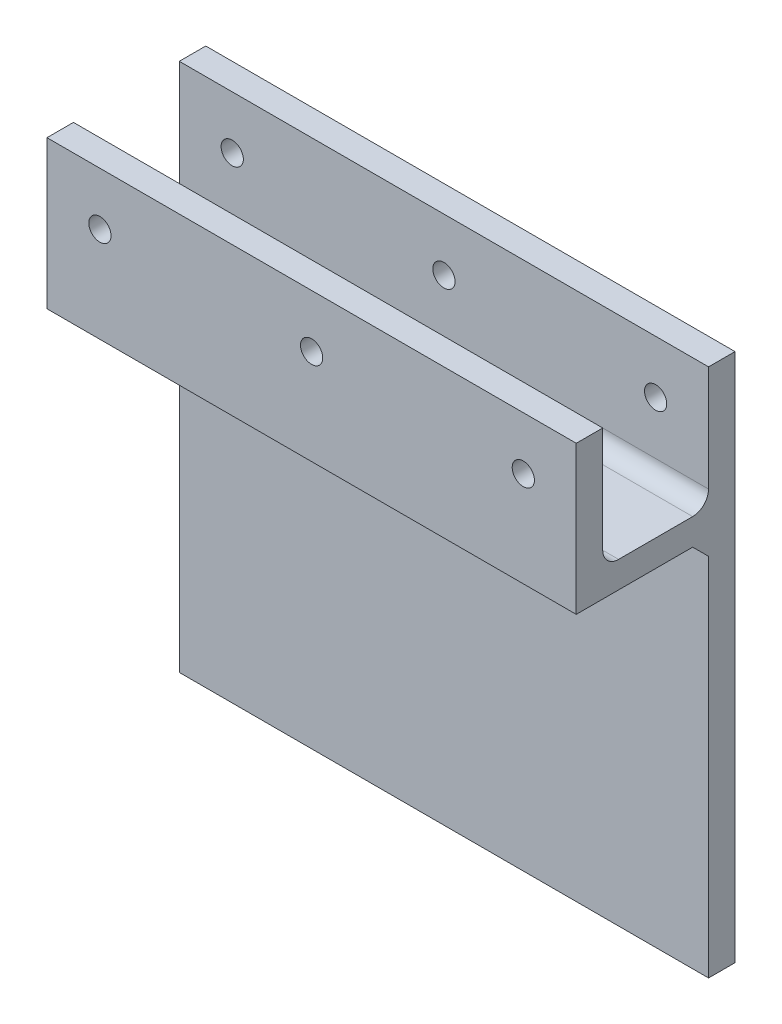
ISO-10303-21;
HEADER;
FILE_DESCRIPTION(('STEP AP214'),'2;1');
FILE_NAME('part.step','',(''),(''),'','','');
FILE_SCHEMA(('AUTOMOTIVE_DESIGN { 1 0 10303 214 1 1 1 1 }'));
ENDSEC;
DATA;
#1=APPLICATION_CONTEXT('core data for automotive mechanical design processes');
#2=APPLICATION_PROTOCOL_DEFINITION('international standard','automotive_design',2000,#1);
#3=PRODUCT_CONTEXT('',#1,'mechanical');
#4=PRODUCT('Part','Part','',(#3));
#5=PRODUCT_RELATED_PRODUCT_CATEGORY('part','',(#4));
#6=PRODUCT_DEFINITION_FORMATION('','',#4);
#7=PRODUCT_DEFINITION_CONTEXT('part definition',#1,'design');
#8=PRODUCT_DEFINITION('design','',#6,#7);
#9=PRODUCT_DEFINITION_SHAPE('','',#8);
#10=(LENGTH_UNIT() NAMED_UNIT(*) SI_UNIT(.MILLI.,.METRE.));
#11=(NAMED_UNIT(*) PLANE_ANGLE_UNIT() SI_UNIT($,.RADIAN.));
#12=(NAMED_UNIT(*) SI_UNIT($,.STERADIAN.) SOLID_ANGLE_UNIT());
#13=UNCERTAINTY_MEASURE_WITH_UNIT(LENGTH_MEASURE(1.E-05),#10,'distance_accuracy_value','');
#14=(GEOMETRIC_REPRESENTATION_CONTEXT(3) GLOBAL_UNCERTAINTY_ASSIGNED_CONTEXT((#13)) GLOBAL_UNIT_ASSIGNED_CONTEXT((#10,
#11,#12)) REPRESENTATION_CONTEXT('',''));
#15=CARTESIAN_POINT('',(0.,0.,0.));
#16=DIRECTION('',(0.,0.,1.));
#17=DIRECTION('',(1.,0.,0.));
#18=AXIS2_PLACEMENT_3D('',#15,#16,#17);
#19=CARTESIAN_POINT('',(0.,27.,30.));
#20=DIRECTION('',(0.,1.,0.));
#21=DIRECTION('',(0.,0.,1.));
#22=AXIS2_PLACEMENT_3D('',#19,#20,#21);
#23=PLANE('',#22);
#24=DIRECTION('',(0.,0.,-1.));
#25=VECTOR('',#24,1.);
#26=CARTESIAN_POINT('',(-50.,27.,30.));
#27=LINE('',#26,#25);
#28=CARTESIAN_POINT('',(-50.,27.,22.));
#29=VERTEX_POINT('',#28);
#30=CARTESIAN_POINT('',(-50.,27.,8.));
#31=VERTEX_POINT('',#30);
#32=EDGE_CURVE('E188',#29,#31,#27,.T.);
#33=ORIENTED_EDGE('',*,*,#32,.F.);
#34=DIRECTION('',(-1.,0.,0.));
#35=VECTOR('',#34,1.);
#36=CARTESIAN_POINT('',(0.,27.,22.));
#37=LINE('',#36,#35);
#38=CARTESIAN_POINT('',(50.,27.,22.));
#39=VERTEX_POINT('',#38);
#40=EDGE_CURVE('E233',#29,#39,#37,.F.);
#41=ORIENTED_EDGE('',*,*,#40,.T.);
#42=DIRECTION('',(0.,0.,-1.));
#43=VECTOR('',#42,1.);
#44=CARTESIAN_POINT('',(50.,27.,30.));
#45=LINE('',#44,#43);
#46=CARTESIAN_POINT('',(50.,27.,8.));
#47=VERTEX_POINT('',#46);
#48=EDGE_CURVE('E191',#39,#47,#45,.T.);
#49=ORIENTED_EDGE('',*,*,#48,.T.);
#50=DIRECTION('',(1.,0.,0.));
#51=VECTOR('',#50,1.);
#52=CARTESIAN_POINT('',(-50.,27.,8.));
#53=LINE('',#52,#51);
#54=EDGE_CURVE('E231',#47,#31,#53,.F.);
#55=ORIENTED_EDGE('',*,*,#54,.T.);
#56=EDGE_LOOP('',(#33,#41,#49,#55));
#57=FACE_BOUND('',#56,.T.);
#58=ADVANCED_FACE('F38',(#57),#23,.T.);
#59=CARTESIAN_POINT('',(-50.,0.,5.));
#60=DIRECTION('',(1.,0.,0.));
#61=DIRECTION('',(0.,1.,0.));
#62=AXIS2_PLACEMENT_3D('',#59,#60,#61);
#63=PLANE('',#62);
#64=DIRECTION('',(0.,-1.,0.));
#65=VECTOR('',#64,1.);
#66=CARTESIAN_POINT('',(-50.,0.,5.));
#67=LINE('',#66,#65);
#68=CARTESIAN_POINT('',(-50.,19.,5.));
#69=VERTEX_POINT('',#68);
#70=CARTESIAN_POINT('',(-50.,-50.,5.));
#71=VERTEX_POINT('',#70);
#72=EDGE_CURVE('E200',#69,#71,#67,.T.);
#73=ORIENTED_EDGE('',*,*,#72,.F.);
#74=DIRECTION('',(0.,0.707106781186547,0.707106781186548));
#75=VECTOR('',#74,1.);
#76=CARTESIAN_POINT('',(-50.,19.,5.));
#77=LINE('',#76,#75);
#78=CARTESIAN_POINT('',(-50.,22.,8.));
#79=VERTEX_POINT('',#78);
#80=EDGE_CURVE('E271',#69,#79,#77,.T.);
#81=ORIENTED_EDGE('',*,*,#80,.T.);
#82=DIRECTION('',(0.,0.,-1.));
#83=VECTOR('',#82,1.);
#84=CARTESIAN_POINT('',(-50.,22.,30.));
#85=LINE('',#84,#83);
#86=CARTESIAN_POINT('',(-50.,22.,30.));
#87=VERTEX_POINT('',#86);
#88=EDGE_CURVE('E197',#87,#79,#85,.T.);
#89=ORIENTED_EDGE('',*,*,#88,.F.);
#90=DIRECTION('',(0.,-1.,0.));
#91=VECTOR('',#90,1.);
#92=CARTESIAN_POINT('',(-50.,0.,30.));
#93=LINE('',#92,#91);
#94=CARTESIAN_POINT('',(-50.,50.,30.));
#95=VERTEX_POINT('',#94);
#96=EDGE_CURVE('E181',#95,#87,#93,.T.);
#97=ORIENTED_EDGE('',*,*,#96,.F.);
#98=DIRECTION('',(0.,0.,1.));
#99=VECTOR('',#98,1.);
#100=CARTESIAN_POINT('',(-50.,50.,25.));
#101=LINE('',#100,#99);
#102=CARTESIAN_POINT('',(-50.,50.,25.));
#103=VERTEX_POINT('',#102);
#104=EDGE_CURVE('E142',#103,#95,#101,.T.);
#105=ORIENTED_EDGE('',*,*,#104,.F.);
#106=DIRECTION('',(0.,-1.,0.));
#107=VECTOR('',#106,1.);
#108=CARTESIAN_POINT('',(-50.,50.,25.));
#109=LINE('',#108,#107);
#110=CARTESIAN_POINT('',(-50.,30.,25.));
#111=VERTEX_POINT('',#110);
#112=EDGE_CURVE('E138',#103,#111,#109,.T.);
#113=ORIENTED_EDGE('',*,*,#112,.T.);
#114=CARTESIAN_POINT('',(-50.,30.,22.));
#115=DIRECTION('',(1.,0.,0.));
#116=DIRECTION('',(0.,1.,0.));
#117=AXIS2_PLACEMENT_3D('',#114,#115,#116);
#118=CIRCLE('',#117,3.);
#119=EDGE_CURVE('E238',#111,#29,#118,.T.);
#120=ORIENTED_EDGE('',*,*,#119,.T.);
#121=ORIENTED_EDGE('',*,*,#32,.T.);
#122=CARTESIAN_POINT('',(-50.,30.,8.));
#123=DIRECTION('',(1.,0.,0.));
#124=DIRECTION('',(0.,1.,0.));
#125=AXIS2_PLACEMENT_3D('',#122,#123,#124);
#126=CIRCLE('',#125,3.);
#127=CARTESIAN_POINT('',(-50.,30.,5.));
#128=VERTEX_POINT('',#127);
#129=EDGE_CURVE('E11',#31,#128,#126,.T.);
#130=ORIENTED_EDGE('',*,*,#129,.T.);
#131=DIRECTION('',(0.,-1.,0.));
#132=VECTOR('',#131,1.);
#133=CARTESIAN_POINT('',(-50.,0.,5.));
#134=LINE('',#133,#132);
#135=CARTESIAN_POINT('',(-50.,50.,5.));
#136=VERTEX_POINT('',#135);
#137=EDGE_CURVE('E162',#136,#128,#134,.T.);
#138=ORIENTED_EDGE('',*,*,#137,.F.);
#139=DIRECTION('',(0.,0.,-1.));
#140=VECTOR('',#139,1.);
#141=CARTESIAN_POINT('',(-50.,50.,5.));
#142=LINE('',#141,#140);
#143=CARTESIAN_POINT('',(-50.,50.,0.));
#144=VERTEX_POINT('',#143);
#145=EDGE_CURVE('E174',#136,#144,#142,.T.);
#146=ORIENTED_EDGE('',*,*,#145,.T.);
#147=DIRECTION('',(0.,-1.,0.));
#148=VECTOR('',#147,1.);
#149=CARTESIAN_POINT('',(-50.,0.,0.));
#150=LINE('',#149,#148);
#151=CARTESIAN_POINT('',(-50.,-50.,0.));
#152=VERTEX_POINT('',#151);
#153=EDGE_CURVE('E199',#144,#152,#150,.T.);
#154=ORIENTED_EDGE('',*,*,#153,.T.);
#155=DIRECTION('',(0.,0.,-1.));
#156=VECTOR('',#155,1.);
#157=CARTESIAN_POINT('',(-50.,-50.,5.));
#158=LINE('',#157,#156);
#159=EDGE_CURVE('E214',#71,#152,#158,.T.);
#160=ORIENTED_EDGE('',*,*,#159,.F.);
#161=EDGE_LOOP('',(#73,#81,#89,#97,#105,#113,#120,#121,#130,#138,#146,#154,#160));
#162=FACE_BOUND('',#161,.T.);
#163=ADVANCED_FACE('F250',(#162),#63,.F.);
#164=CARTESIAN_POINT('',(0.,-50.,5.));
#165=DIRECTION('',(0.,1.,0.));
#166=DIRECTION('',(0.,0.,1.));
#167=AXIS2_PLACEMENT_3D('',#164,#165,#166);
#168=PLANE('',#167);
#169=DIRECTION('',(1.,0.,0.));
#170=VECTOR('',#169,1.);
#171=CARTESIAN_POINT('',(0.,-50.,0.));
#172=LINE('',#171,#170);
#173=CARTESIAN_POINT('',(50.,-50.,0.));
#174=VERTEX_POINT('',#173);
#175=EDGE_CURVE('E208',#152,#174,#172,.T.);
#176=ORIENTED_EDGE('',*,*,#175,.T.);
#177=DIRECTION('',(0.,0.,-1.));
#178=VECTOR('',#177,1.);
#179=CARTESIAN_POINT('',(50.,-50.,5.));
#180=LINE('',#179,#178);
#181=CARTESIAN_POINT('',(50.,-50.,5.));
#182=VERTEX_POINT('',#181);
#183=EDGE_CURVE('E206',#182,#174,#180,.T.);
#184=ORIENTED_EDGE('',*,*,#183,.F.);
#185=DIRECTION('',(1.,0.,0.));
#186=VECTOR('',#185,1.);
#187=CARTESIAN_POINT('',(0.,-50.,5.));
#188=LINE('',#187,#186);
#189=EDGE_CURVE('E202',#71,#182,#188,.T.);
#190=ORIENTED_EDGE('',*,*,#189,.F.);
#191=ORIENTED_EDGE('',*,*,#159,.T.);
#192=EDGE_LOOP('',(#176,#184,#190,#191));
#193=FACE_BOUND('',#192,.T.);
#194=ADVANCED_FACE('F262',(#193),#168,.F.);
#195=CARTESIAN_POINT('',(50.,0.,5.));
#196=DIRECTION('',(1.,0.,0.));
#197=DIRECTION('',(0.,1.,0.));
#198=AXIS2_PLACEMENT_3D('',#195,#196,#197);
#199=PLANE('',#198);
#200=DIRECTION('',(0.,0.707106781186547,0.707106781186548));
#201=VECTOR('',#200,1.);
#202=CARTESIAN_POINT('',(50.,19.,5.));
#203=LINE('',#202,#201);
#204=CARTESIAN_POINT('',(50.,19.,5.));
#205=VERTEX_POINT('',#204);
#206=CARTESIAN_POINT('',(50.,22.,8.));
#207=VERTEX_POINT('',#206);
#208=EDGE_CURVE('E266',#205,#207,#203,.T.);
#209=ORIENTED_EDGE('',*,*,#208,.F.);
#210=DIRECTION('',(0.,-1.,0.));
#211=VECTOR('',#210,1.);
#212=CARTESIAN_POINT('',(50.,0.,5.));
#213=LINE('',#212,#211);
#214=EDGE_CURVE('E53',#205,#182,#213,.T.);
#215=ORIENTED_EDGE('',*,*,#214,.T.);
#216=ORIENTED_EDGE('',*,*,#183,.T.);
#217=DIRECTION('',(0.,-1.,0.));
#218=VECTOR('',#217,1.);
#219=CARTESIAN_POINT('',(50.,0.,0.));
#220=LINE('',#219,#218);
#221=CARTESIAN_POINT('',(50.,50.,0.));
#222=VERTEX_POINT('',#221);
#223=EDGE_CURVE('E203',#222,#174,#220,.T.);
#224=ORIENTED_EDGE('',*,*,#223,.F.);
#225=DIRECTION('',(0.,0.,-1.));
#226=VECTOR('',#225,1.);
#227=CARTESIAN_POINT('',(50.,50.,5.));
#228=LINE('',#227,#226);
#229=CARTESIAN_POINT('',(50.,50.,5.));
#230=VERTEX_POINT('',#229);
#231=EDGE_CURVE('E178',#230,#222,#228,.T.);
#232=ORIENTED_EDGE('',*,*,#231,.F.);
#233=DIRECTION('',(0.,-1.,0.));
#234=VECTOR('',#233,1.);
#235=CARTESIAN_POINT('',(50.,0.,5.));
#236=LINE('',#235,#234);
#237=CARTESIAN_POINT('',(50.,30.,5.));
#238=VERTEX_POINT('',#237);
#239=EDGE_CURVE('E169',#230,#238,#236,.T.);
#240=ORIENTED_EDGE('',*,*,#239,.T.);
#241=CARTESIAN_POINT('',(50.,30.,8.));
#242=DIRECTION('',(1.,0.,0.));
#243=DIRECTION('',(0.,1.,0.));
#244=AXIS2_PLACEMENT_3D('',#241,#242,#243);
#245=CIRCLE('',#244,3.);
#246=EDGE_CURVE('E46',#238,#47,#245,.F.);
#247=ORIENTED_EDGE('',*,*,#246,.T.);
#248=ORIENTED_EDGE('',*,*,#48,.F.);
#249=CARTESIAN_POINT('',(50.,30.,22.));
#250=DIRECTION('',(1.,0.,0.));
#251=DIRECTION('',(0.,1.,0.));
#252=AXIS2_PLACEMENT_3D('',#249,#250,#251);
#253=CIRCLE('',#252,3.);
#254=CARTESIAN_POINT('',(50.,30.,25.));
#255=VERTEX_POINT('',#254);
#256=EDGE_CURVE('E158',#39,#255,#253,.F.);
#257=ORIENTED_EDGE('',*,*,#256,.T.);
#258=DIRECTION('',(0.,-1.,0.));
#259=VECTOR('',#258,1.);
#260=CARTESIAN_POINT('',(50.,50.,25.));
#261=LINE('',#260,#259);
#262=CARTESIAN_POINT('',(50.,50.,25.));
#263=VERTEX_POINT('',#262);
#264=EDGE_CURVE('E135',#263,#255,#261,.T.);
#265=ORIENTED_EDGE('',*,*,#264,.F.);
#266=DIRECTION('',(0.,0.,-1.));
#267=VECTOR('',#266,1.);
#268=CARTESIAN_POINT('',(50.,50.,25.));
#269=LINE('',#268,#267);
#270=CARTESIAN_POINT('',(50.,50.,30.));
#271=VERTEX_POINT('',#270);
#272=EDGE_CURVE('E143',#271,#263,#269,.T.);
#273=ORIENTED_EDGE('',*,*,#272,.F.);
#274=DIRECTION('',(0.,-1.,0.));
#275=VECTOR('',#274,1.);
#276=CARTESIAN_POINT('',(50.,0.,30.));
#277=LINE('',#276,#275);
#278=CARTESIAN_POINT('',(50.,22.,30.));
#279=VERTEX_POINT('',#278);
#280=EDGE_CURVE('E186',#271,#279,#277,.T.);
#281=ORIENTED_EDGE('',*,*,#280,.T.);
#282=DIRECTION('',(0.,0.,-1.));
#283=VECTOR('',#282,1.);
#284=CARTESIAN_POINT('',(50.,22.,30.));
#285=LINE('',#284,#283);
#286=EDGE_CURVE('E194',#279,#207,#285,.T.);
#287=ORIENTED_EDGE('',*,*,#286,.T.);
#288=EDGE_LOOP('',(#209,#215,#216,#224,#232,#240,#247,#248,#257,#265,#273,#281,#287));
#289=FACE_BOUND('',#288,.T.);
#290=ADVANCED_FACE('F155',(#289),#199,.T.);
#291=CARTESIAN_POINT('',(0.,0.,5.));
#292=DIRECTION('',(0.,0.,1.));
#293=DIRECTION('',(1.,0.,0.));
#294=AXIS2_PLACEMENT_3D('',#291,#292,#293);
#295=PLANE('',#294);
#296=DIRECTION('',(-1.,0.,0.));
#297=VECTOR('',#296,1.);
#298=CARTESIAN_POINT('',(50.,19.,5.));
#299=LINE('',#298,#297);
#300=EDGE_CURVE('E57',#205,#69,#299,.T.);
#301=ORIENTED_EDGE('',*,*,#300,.T.);
#302=ORIENTED_EDGE('',*,*,#72,.T.);
#303=ORIENTED_EDGE('',*,*,#189,.T.);
#304=ORIENTED_EDGE('',*,*,#214,.F.);
#305=EDGE_LOOP('',(#301,#302,#303,#304));
#306=FACE_BOUND('',#305,.T.);
#307=ADVANCED_FACE('F267',(#306),#295,.T.);
#308=CARTESIAN_POINT('',(0.,0.,0.));
#309=DIRECTION('',(0.,0.,1.));
#310=DIRECTION('',(1.,0.,0.));
#311=AXIS2_PLACEMENT_3D('',#308,#309,#310);
#312=PLANE('',#311);
#313=CARTESIAN_POINT('',(-40.,40.,0.));
#314=DIRECTION('',(0.,0.,1.));
#315=DIRECTION('',(1.,0.,0.));
#316=AXIS2_PLACEMENT_3D('',#313,#314,#315);
#317=CIRCLE('',#316,2.1);
#318=CARTESIAN_POINT('',(-37.9,40.,0.));
#319=VERTEX_POINT('',#318);
#320=EDGE_CURVE('E222',#319,#319,#317,.T.);
#321=ORIENTED_EDGE('',*,*,#320,.T.);
#322=EDGE_LOOP('',(#321));
#323=FACE_BOUND('',#322,.T.);
#324=CARTESIAN_POINT('',(0.,40.,0.));
#325=DIRECTION('',(0.,0.,1.));
#326=DIRECTION('',(1.,0.,0.));
#327=AXIS2_PLACEMENT_3D('',#324,#325,#326);
#328=CIRCLE('',#327,2.1);
#329=CARTESIAN_POINT('',(2.09999999999999,40.,0.));
#330=VERTEX_POINT('',#329);
#331=EDGE_CURVE('E287',#330,#330,#328,.T.);
#332=ORIENTED_EDGE('',*,*,#331,.T.);
#333=EDGE_LOOP('',(#332));
#334=FACE_BOUND('',#333,.T.);
#335=CARTESIAN_POINT('',(40.,40.,0.));
#336=DIRECTION('',(0.,0.,1.));
#337=DIRECTION('',(1.,0.,0.));
#338=AXIS2_PLACEMENT_3D('',#335,#336,#337);
#339=CIRCLE('',#338,2.1);
#340=CARTESIAN_POINT('',(42.1,40.,0.));
#341=VERTEX_POINT('',#340);
#342=EDGE_CURVE('E293',#341,#341,#339,.T.);
#343=ORIENTED_EDGE('',*,*,#342,.T.);
#344=EDGE_LOOP('',(#343));
#345=FACE_BOUND('',#344,.T.);
#346=ORIENTED_EDGE('',*,*,#153,.F.);
#347=DIRECTION('',(1.,0.,0.));
#348=VECTOR('',#347,1.);
#349=CARTESIAN_POINT('',(0.,50.,0.));
#350=LINE('',#349,#348);
#351=EDGE_CURVE('E159',#144,#222,#350,.T.);
#352=ORIENTED_EDGE('',*,*,#351,.T.);
#353=ORIENTED_EDGE('',*,*,#223,.T.);
#354=ORIENTED_EDGE('',*,*,#175,.F.);
#355=EDGE_LOOP('',(#346,#352,#353,#354));
#356=FACE_BOUND('',#355,.T.);
#357=ADVANCED_FACE('F264',(#323,#334,#345,#356),#312,.F.);
#358=CARTESIAN_POINT('',(0.,22.,30.));
#359=DIRECTION('',(0.,1.,0.));
#360=DIRECTION('',(0.,0.,1.));
#361=AXIS2_PLACEMENT_3D('',#358,#359,#360);
#362=PLANE('',#361);
#363=ORIENTED_EDGE('',*,*,#88,.T.);
#364=DIRECTION('',(-1.,0.,0.));
#365=VECTOR('',#364,1.);
#366=CARTESIAN_POINT('',(50.,22.,8.));
#367=LINE('',#366,#365);
#368=EDGE_CURVE('E275',#207,#79,#367,.T.);
#369=ORIENTED_EDGE('',*,*,#368,.F.);
#370=ORIENTED_EDGE('',*,*,#286,.F.);
#371=DIRECTION('',(1.,0.,0.));
#372=VECTOR('',#371,1.);
#373=CARTESIAN_POINT('',(0.,22.,30.));
#374=LINE('',#373,#372);
#375=EDGE_CURVE('E184',#87,#279,#374,.T.);
#376=ORIENTED_EDGE('',*,*,#375,.F.);
#377=EDGE_LOOP('',(#363,#369,#370,#376));
#378=FACE_BOUND('',#377,.T.);
#379=ADVANCED_FACE('F308',(#378),#362,.F.);
#380=CARTESIAN_POINT('',(0.,0.,30.));
#381=DIRECTION('',(0.,0.,1.));
#382=DIRECTION('',(1.,0.,0.));
#383=AXIS2_PLACEMENT_3D('',#380,#381,#382);
#384=PLANE('',#383);
#385=CARTESIAN_POINT('',(-40.,40.,30.));
#386=DIRECTION('',(0.,0.,1.));
#387=DIRECTION('',(1.,0.,0.));
#388=AXIS2_PLACEMENT_3D('',#385,#386,#387);
#389=CIRCLE('',#388,2.1);
#390=CARTESIAN_POINT('',(-37.9,40.,30.));
#391=VERTEX_POINT('',#390);
#392=EDGE_CURVE('E284',#391,#391,#389,.T.);
#393=ORIENTED_EDGE('',*,*,#392,.F.);
#394=EDGE_LOOP('',(#393));
#395=FACE_BOUND('',#394,.T.);
#396=CARTESIAN_POINT('',(0.,40.,30.));
#397=DIRECTION('',(0.,0.,1.));
#398=DIRECTION('',(1.,0.,0.));
#399=AXIS2_PLACEMENT_3D('',#396,#397,#398);
#400=CIRCLE('',#399,2.1);
#401=CARTESIAN_POINT('',(2.09999999999999,40.,30.));
#402=VERTEX_POINT('',#401);
#403=EDGE_CURVE('E290',#402,#402,#400,.T.);
#404=ORIENTED_EDGE('',*,*,#403,.F.);
#405=EDGE_LOOP('',(#404));
#406=FACE_BOUND('',#405,.T.);
#407=CARTESIAN_POINT('',(40.,40.,30.));
#408=DIRECTION('',(0.,0.,1.));
#409=DIRECTION('',(1.,0.,0.));
#410=AXIS2_PLACEMENT_3D('',#407,#408,#409);
#411=CIRCLE('',#410,2.1);
#412=CARTESIAN_POINT('',(42.1,40.,30.));
#413=VERTEX_POINT('',#412);
#414=EDGE_CURVE('E280',#413,#413,#411,.T.);
#415=ORIENTED_EDGE('',*,*,#414,.F.);
#416=EDGE_LOOP('',(#415));
#417=FACE_BOUND('',#416,.T.);
#418=ORIENTED_EDGE('',*,*,#96,.T.);
#419=ORIENTED_EDGE('',*,*,#375,.T.);
#420=ORIENTED_EDGE('',*,*,#280,.F.);
#421=DIRECTION('',(1.,0.,0.));
#422=VECTOR('',#421,1.);
#423=CARTESIAN_POINT('',(-50.,50.,30.));
#424=LINE('',#423,#422);
#425=EDGE_CURVE('E149',#95,#271,#424,.T.);
#426=ORIENTED_EDGE('',*,*,#425,.F.);
#427=EDGE_LOOP('',(#418,#419,#420,#426));
#428=FACE_BOUND('',#427,.T.);
#429=ADVANCED_FACE('F305',(#395,#406,#417,#428),#384,.T.);
#430=CARTESIAN_POINT('',(0.,50.,5.));
#431=DIRECTION('',(0.,1.,0.));
#432=DIRECTION('',(0.,0.,1.));
#433=AXIS2_PLACEMENT_3D('',#430,#431,#432);
#434=PLANE('',#433);
#435=ORIENTED_EDGE('',*,*,#351,.F.);
#436=ORIENTED_EDGE('',*,*,#145,.F.);
#437=DIRECTION('',(1.,0.,0.));
#438=VECTOR('',#437,1.);
#439=CARTESIAN_POINT('',(0.,50.,5.));
#440=LINE('',#439,#438);
#441=EDGE_CURVE('E172',#136,#230,#440,.T.);
#442=ORIENTED_EDGE('',*,*,#441,.T.);
#443=ORIENTED_EDGE('',*,*,#231,.T.);
#444=EDGE_LOOP('',(#435,#436,#442,#443));
#445=FACE_BOUND('',#444,.T.);
#446=ADVANCED_FACE('F256',(#445),#434,.T.);
#447=CARTESIAN_POINT('',(0.,0.,5.));
#448=DIRECTION('',(0.,0.,1.));
#449=DIRECTION('',(1.,0.,0.));
#450=AXIS2_PLACEMENT_3D('',#447,#448,#449);
#451=PLANE('',#450);
#452=CARTESIAN_POINT('',(-40.,40.,5.));
#453=DIRECTION('',(0.,0.,1.));
#454=DIRECTION('',(1.,0.,0.));
#455=AXIS2_PLACEMENT_3D('',#452,#453,#454);
#456=CIRCLE('',#455,2.1);
#457=CARTESIAN_POINT('',(-37.9,40.,5.));
#458=VERTEX_POINT('',#457);
#459=EDGE_CURVE('E152',#458,#458,#456,.T.);
#460=ORIENTED_EDGE('',*,*,#459,.F.);
#461=EDGE_LOOP('',(#460));
#462=FACE_BOUND('',#461,.T.);
#463=CARTESIAN_POINT('',(0.,40.,5.));
#464=DIRECTION('',(0.,0.,1.));
#465=DIRECTION('',(1.,0.,0.));
#466=AXIS2_PLACEMENT_3D('',#463,#464,#465);
#467=CIRCLE('',#466,2.1);
#468=CARTESIAN_POINT('',(2.09999999999999,40.,5.));
#469=VERTEX_POINT('',#468);
#470=EDGE_CURVE('E226',#469,#469,#467,.T.);
#471=ORIENTED_EDGE('',*,*,#470,.F.);
#472=EDGE_LOOP('',(#471));
#473=FACE_BOUND('',#472,.T.);
#474=CARTESIAN_POINT('',(40.,40.,5.));
#475=DIRECTION('',(0.,0.,1.));
#476=DIRECTION('',(1.,0.,0.));
#477=AXIS2_PLACEMENT_3D('',#474,#475,#476);
#478=CIRCLE('',#477,2.1);
#479=CARTESIAN_POINT('',(42.1,40.,5.));
#480=VERTEX_POINT('',#479);
#481=EDGE_CURVE('E221',#480,#480,#478,.T.);
#482=ORIENTED_EDGE('',*,*,#481,.F.);
#483=EDGE_LOOP('',(#482));
#484=FACE_BOUND('',#483,.T.);
#485=ORIENTED_EDGE('',*,*,#137,.T.);
#486=DIRECTION('',(1.,0.,0.));
#487=VECTOR('',#486,1.);
#488=CARTESIAN_POINT('',(50.,30.,5.));
#489=LINE('',#488,#487);
#490=EDGE_CURVE('E235',#128,#238,#489,.T.);
#491=ORIENTED_EDGE('',*,*,#490,.T.);
#492=ORIENTED_EDGE('',*,*,#239,.F.);
#493=ORIENTED_EDGE('',*,*,#441,.F.);
#494=EDGE_LOOP('',(#485,#491,#492,#493));
#495=FACE_BOUND('',#494,.T.);
#496=ADVANCED_FACE('F253',(#462,#473,#484,#495),#451,.T.);
#497=CARTESIAN_POINT('',(-50.,50.,25.));
#498=DIRECTION('',(0.,0.,1.));
#499=DIRECTION('',(1.,0.,0.));
#500=AXIS2_PLACEMENT_3D('',#497,#498,#499);
#501=PLANE('',#500);
#502=CARTESIAN_POINT('',(-40.,40.,25.));
#503=DIRECTION('',(0.,0.,1.));
#504=DIRECTION('',(1.,0.,0.));
#505=AXIS2_PLACEMENT_3D('',#502,#503,#504);
#506=CIRCLE('',#505,2.1);
#507=CARTESIAN_POINT('',(-37.9,40.,25.));
#508=VERTEX_POINT('',#507);
#509=EDGE_CURVE('E227',#508,#508,#506,.T.);
#510=ORIENTED_EDGE('',*,*,#509,.T.);
#511=EDGE_LOOP('',(#510));
#512=FACE_BOUND('',#511,.T.);
#513=CARTESIAN_POINT('',(0.,40.,25.));
#514=DIRECTION('',(0.,0.,1.));
#515=DIRECTION('',(1.,0.,0.));
#516=AXIS2_PLACEMENT_3D('',#513,#514,#515);
#517=CIRCLE('',#516,2.1);
#518=CARTESIAN_POINT('',(2.09999999999999,40.,25.));
#519=VERTEX_POINT('',#518);
#520=EDGE_CURVE('E223',#519,#519,#517,.T.);
#521=ORIENTED_EDGE('',*,*,#520,.T.);
#522=EDGE_LOOP('',(#521));
#523=FACE_BOUND('',#522,.T.);
#524=CARTESIAN_POINT('',(40.,40.,25.));
#525=DIRECTION('',(0.,0.,1.));
#526=DIRECTION('',(1.,0.,0.));
#527=AXIS2_PLACEMENT_3D('',#524,#525,#526);
#528=CIRCLE('',#527,2.1);
#529=CARTESIAN_POINT('',(42.1,40.,25.));
#530=VERTEX_POINT('',#529);
#531=EDGE_CURVE('E218',#530,#530,#528,.T.);
#532=ORIENTED_EDGE('',*,*,#531,.T.);
#533=EDGE_LOOP('',(#532));
#534=FACE_BOUND('',#533,.T.);
#535=ORIENTED_EDGE('',*,*,#264,.T.);
#536=DIRECTION('',(-1.,0.,0.));
#537=VECTOR('',#536,1.);
#538=CARTESIAN_POINT('',(-50.,30.,25.));
#539=LINE('',#538,#537);
#540=EDGE_CURVE('E217',#255,#111,#539,.T.);
#541=ORIENTED_EDGE('',*,*,#540,.T.);
#542=ORIENTED_EDGE('',*,*,#112,.F.);
#543=DIRECTION('',(-1.,0.,0.));
#544=VECTOR('',#543,1.);
#545=CARTESIAN_POINT('',(-50.,50.,25.));
#546=LINE('',#545,#544);
#547=EDGE_CURVE('E130',#263,#103,#546,.T.);
#548=ORIENTED_EDGE('',*,*,#547,.F.);
#549=EDGE_LOOP('',(#535,#541,#542,#548));
#550=FACE_BOUND('',#549,.T.);
#551=ADVANCED_FACE('F132',(#512,#523,#534,#550),#501,.F.);
#552=CARTESIAN_POINT('',(0.,50.,0.));
#553=DIRECTION('',(0.,1.,0.));
#554=DIRECTION('',(0.,0.,1.));
#555=AXIS2_PLACEMENT_3D('',#552,#553,#554);
#556=PLANE('',#555);
#557=ORIENTED_EDGE('',*,*,#272,.T.);
#558=ORIENTED_EDGE('',*,*,#547,.T.);
#559=ORIENTED_EDGE('',*,*,#104,.T.);
#560=ORIENTED_EDGE('',*,*,#425,.T.);
#561=EDGE_LOOP('',(#557,#558,#559,#560));
#562=FACE_BOUND('',#561,.T.);
#563=ADVANCED_FACE('F147',(#562),#556,.T.);
#564=CARTESIAN_POINT('',(40.,40.,0.));
#565=DIRECTION('',(0.,0.,1.));
#566=DIRECTION('',(1.,0.,0.));
#567=AXIS2_PLACEMENT_3D('',#564,#565,#566);
#568=CYLINDRICAL_SURFACE('',#567,2.1);
#569=ORIENTED_EDGE('',*,*,#414,.T.);
#570=EDGE_LOOP('',(#569));
#571=FACE_BOUND('',#570,.T.);
#572=ORIENTED_EDGE('',*,*,#531,.F.);
#573=EDGE_LOOP('',(#572));
#574=FACE_BOUND('',#573,.T.);
#575=ADVANCED_FACE('F337',(#571,#574),#568,.F.);
#576=CARTESIAN_POINT('',(0.,40.,0.));
#577=DIRECTION('',(0.,0.,1.));
#578=DIRECTION('',(1.,0.,0.));
#579=AXIS2_PLACEMENT_3D('',#576,#577,#578);
#580=CYLINDRICAL_SURFACE('',#579,2.1);
#581=ORIENTED_EDGE('',*,*,#403,.T.);
#582=EDGE_LOOP('',(#581));
#583=FACE_BOUND('',#582,.T.);
#584=ORIENTED_EDGE('',*,*,#520,.F.);
#585=EDGE_LOOP('',(#584));
#586=FACE_BOUND('',#585,.T.);
#587=ADVANCED_FACE('F348',(#583,#586),#580,.F.);
#588=CARTESIAN_POINT('',(-40.,40.,0.));
#589=DIRECTION('',(0.,0.,1.));
#590=DIRECTION('',(1.,0.,0.));
#591=AXIS2_PLACEMENT_3D('',#588,#589,#590);
#592=CYLINDRICAL_SURFACE('',#591,2.1);
#593=ORIENTED_EDGE('',*,*,#392,.T.);
#594=EDGE_LOOP('',(#593));
#595=FACE_BOUND('',#594,.T.);
#596=ORIENTED_EDGE('',*,*,#509,.F.);
#597=EDGE_LOOP('',(#596));
#598=FACE_BOUND('',#597,.T.);
#599=ADVANCED_FACE('F342',(#595,#598),#592,.F.);
#600=ORIENTED_EDGE('',*,*,#481,.T.);
#601=EDGE_LOOP('',(#600));
#602=FACE_BOUND('',#601,.T.);
#603=ORIENTED_EDGE('',*,*,#342,.F.);
#604=EDGE_LOOP('',(#603));
#605=FACE_BOUND('',#604,.T.);
#606=ADVANCED_FACE('F338',(#602,#605),#568,.F.);
#607=ORIENTED_EDGE('',*,*,#470,.T.);
#608=EDGE_LOOP('',(#607));
#609=FACE_BOUND('',#608,.T.);
#610=ORIENTED_EDGE('',*,*,#331,.F.);
#611=EDGE_LOOP('',(#610));
#612=FACE_BOUND('',#611,.T.);
#613=ADVANCED_FACE('F341',(#609,#612),#580,.F.);
#614=ORIENTED_EDGE('',*,*,#459,.T.);
#615=EDGE_LOOP('',(#614));
#616=FACE_BOUND('',#615,.T.);
#617=ORIENTED_EDGE('',*,*,#320,.F.);
#618=EDGE_LOOP('',(#617));
#619=FACE_BOUND('',#618,.T.);
#620=ADVANCED_FACE('F346',(#616,#619),#592,.F.);
#621=CARTESIAN_POINT('',(-50.,30.,22.));
#622=DIRECTION('',(-1.,0.,0.));
#623=DIRECTION('',(0.,0.,1.));
#624=AXIS2_PLACEMENT_3D('',#621,#622,#623);
#625=CYLINDRICAL_SURFACE('',#624,3.);
#626=ORIENTED_EDGE('',*,*,#256,.F.);
#627=ORIENTED_EDGE('',*,*,#40,.F.);
#628=ORIENTED_EDGE('',*,*,#119,.F.);
#629=ORIENTED_EDGE('',*,*,#540,.F.);
#630=EDGE_LOOP('',(#626,#627,#628,#629));
#631=FACE_BOUND('',#630,.T.);
#632=ADVANCED_FACE('F351',(#631),#625,.F.);
#633=CARTESIAN_POINT('',(0.,30.,8.));
#634=DIRECTION('',(-1.,0.,0.));
#635=DIRECTION('',(0.,0.,1.));
#636=AXIS2_PLACEMENT_3D('',#633,#634,#635);
#637=CYLINDRICAL_SURFACE('',#636,3.);
#638=ORIENTED_EDGE('',*,*,#129,.F.);
#639=ORIENTED_EDGE('',*,*,#54,.F.);
#640=ORIENTED_EDGE('',*,*,#246,.F.);
#641=ORIENTED_EDGE('',*,*,#490,.F.);
#642=EDGE_LOOP('',(#638,#639,#640,#641));
#643=FACE_BOUND('',#642,.T.);
#644=ADVANCED_FACE('F40',(#643),#637,.F.);
#645=CARTESIAN_POINT('',(50.,19.,5.));
#646=DIRECTION('',(0.,-0.707106781186548,0.707106781186547));
#647=DIRECTION('',(0.,-0.707106781186547,-0.707106781186548));
#648=AXIS2_PLACEMENT_3D('',#645,#646,#647);
#649=PLANE('',#648);
#650=ORIENTED_EDGE('',*,*,#80,.F.);
#651=ORIENTED_EDGE('',*,*,#300,.F.);
#652=ORIENTED_EDGE('',*,*,#208,.T.);
#653=ORIENTED_EDGE('',*,*,#368,.T.);
#654=EDGE_LOOP('',(#650,#651,#652,#653));
#655=FACE_BOUND('',#654,.T.);
#656=ADVANCED_FACE('F274',(#655),#649,.T.);
#657=CLOSED_SHELL('',(#58,#163,#194,#290,#307,#357,#379,#429,#446,#496,#551,#563,#575,#587,#599,
#606,#613,#620,#632,#644,#656));
#658=MANIFOLD_SOLID_BREP('B2',#657);
#659=ADVANCED_BREP_SHAPE_REPRESENTATION('',(#18,#658),#14);
#660=SHAPE_DEFINITION_REPRESENTATION(#9,#659);
ENDSEC;
END-ISO-10303-21;
